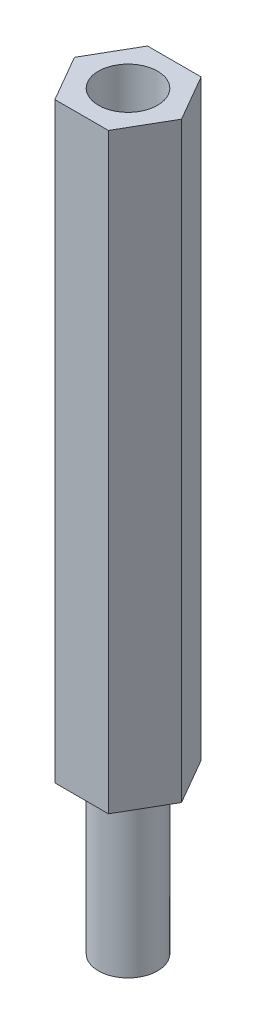
ISO-10303-21;
HEADER;
FILE_DESCRIPTION(('STEP AP214'),'2;1');
FILE_NAME('part.step','',(''),(''),'','','');
FILE_SCHEMA(('AUTOMOTIVE_DESIGN { 1 0 10303 214 1 1 1 1 }'));
ENDSEC;
DATA;
#1=APPLICATION_CONTEXT('core data for automotive mechanical design processes');
#2=APPLICATION_PROTOCOL_DEFINITION('international standard','automotive_design',2000,#1);
#3=PRODUCT_CONTEXT('',#1,'mechanical');
#4=PRODUCT('Part','Part','',(#3));
#5=PRODUCT_RELATED_PRODUCT_CATEGORY('part','',(#4));
#6=PRODUCT_DEFINITION_FORMATION('','',#4);
#7=PRODUCT_DEFINITION_CONTEXT('part definition',#1,'design');
#8=PRODUCT_DEFINITION('design','',#6,#7);
#9=PRODUCT_DEFINITION_SHAPE('','',#8);
#10=(LENGTH_UNIT() NAMED_UNIT(*) SI_UNIT(.MILLI.,.METRE.));
#11=(NAMED_UNIT(*) PLANE_ANGLE_UNIT() SI_UNIT($,.RADIAN.));
#12=(NAMED_UNIT(*) SI_UNIT($,.STERADIAN.) SOLID_ANGLE_UNIT());
#13=UNCERTAINTY_MEASURE_WITH_UNIT(LENGTH_MEASURE(1.E-05),#10,'distance_accuracy_value','');
#14=(GEOMETRIC_REPRESENTATION_CONTEXT(3) GLOBAL_UNCERTAINTY_ASSIGNED_CONTEXT((#13)) GLOBAL_UNIT_ASSIGNED_CONTEXT((#10,
#11,#12)) REPRESENTATION_CONTEXT('',''));
#15=CARTESIAN_POINT('',(0.,0.,0.));
#16=DIRECTION('',(0.,0.,1.));
#17=DIRECTION('',(1.,0.,0.));
#18=AXIS2_PLACEMENT_3D('',#15,#16,#17);
#19=CARTESIAN_POINT('',(0.,-8.,0.));
#20=DIRECTION('',(0.,1.,0.));
#21=DIRECTION('',(0.,0.,1.));
#22=AXIS2_PLACEMENT_3D('',#19,#20,#21);
#23=CYLINDRICAL_SURFACE('',#22,1.5);
#24=CARTESIAN_POINT('',(0.,-8.,0.));
#25=DIRECTION('',(0.,-1.,0.));
#26=DIRECTION('',(0.,0.,-1.));
#27=AXIS2_PLACEMENT_3D('',#24,#25,#26);
#28=CIRCLE('',#27,1.5);
#29=CARTESIAN_POINT('',(0.,-8.,-1.5));
#30=VERTEX_POINT('',#29);
#31=EDGE_CURVE('E11',#30,#30,#28,.T.);
#32=ORIENTED_EDGE('',*,*,#31,.F.);
#33=EDGE_LOOP('',(#32));
#34=FACE_BOUND('',#33,.T.);
#35=CARTESIAN_POINT('',(0.,0.,0.));
#36=DIRECTION('',(0.,-1.,0.));
#37=DIRECTION('',(0.,0.,-1.));
#38=AXIS2_PLACEMENT_3D('',#35,#36,#37);
#39=CIRCLE('',#38,1.5);
#40=CARTESIAN_POINT('',(0.,0.,-1.5));
#41=VERTEX_POINT('',#40);
#42=EDGE_CURVE('E45',#41,#41,#39,.T.);
#43=ORIENTED_EDGE('',*,*,#42,.T.);
#44=EDGE_LOOP('',(#43));
#45=FACE_BOUND('',#44,.T.);
#46=ADVANCED_FACE('F42',(#34,#45),#23,.T.);
#47=CARTESIAN_POINT('',(0.,-8.,0.));
#48=DIRECTION('',(0.,-1.,0.));
#49=DIRECTION('',(0.,0.,-1.));
#50=AXIS2_PLACEMENT_3D('',#47,#48,#49);
#51=PLANE('',#50);
#52=ORIENTED_EDGE('',*,*,#31,.T.);
#53=EDGE_LOOP('',(#52));
#54=FACE_BOUND('',#53,.T.);
#55=ADVANCED_FACE('F57',(#54),#51,.T.);
#56=CARTESIAN_POINT('',(0.,0.,0.));
#57=DIRECTION('',(0.,-1.,0.));
#58=DIRECTION('',(0.,0.,-1.));
#59=AXIS2_PLACEMENT_3D('',#56,#57,#58);
#60=PLANE('',#59);
#61=ORIENTED_EDGE('',*,*,#42,.F.);
#62=EDGE_LOOP('',(#61));
#63=FACE_BOUND('',#62,.T.);
#64=ADVANCED_FACE('F55',(#63),#60,.F.);
#65=CLOSED_SHELL('',(#46,#55,#64));
#66=MANIFOLD_SOLID_BREP('B2',#65);
#67=CARTESIAN_POINT('',(0.,30.,0.));
#68=DIRECTION('',(0.,1.,0.));
#69=DIRECTION('',(0.,0.,1.));
#70=AXIS2_PLACEMENT_3D('',#67,#68,#69);
#71=PLANE('',#70);
#72=DIRECTION('',(0.5,0.,-0.866025403784438));
#73=VECTOR('',#72,1.);
#74=CARTESIAN_POINT('',(1.35677313259562,30.,2.35));
#75=LINE('',#74,#73);
#76=CARTESIAN_POINT('',(1.35677313259562,30.,2.35));
#77=VERTEX_POINT('',#76);
#78=CARTESIAN_POINT('',(2.71354626519124,30.,0.));
#79=VERTEX_POINT('',#78);
#80=EDGE_CURVE('E178',#77,#79,#75,.T.);
#81=ORIENTED_EDGE('',*,*,#80,.T.);
#82=DIRECTION('',(-0.5,0.,-0.866025403784438));
#83=VECTOR('',#82,1.);
#84=CARTESIAN_POINT('',(2.71354626519124,30.,0.));
#85=LINE('',#84,#83);
#86=CARTESIAN_POINT('',(1.35677313259562,30.,-2.35));
#87=VERTEX_POINT('',#86);
#88=EDGE_CURVE('E136',#79,#87,#85,.T.);
#89=ORIENTED_EDGE('',*,*,#88,.T.);
#90=DIRECTION('',(-1.,0.,0.));
#91=VECTOR('',#90,1.);
#92=CARTESIAN_POINT('',(1.35677313259562,30.,-2.35));
#93=LINE('',#92,#91);
#94=CARTESIAN_POINT('',(-1.35677313259562,30.,-2.35));
#95=VERTEX_POINT('',#94);
#96=EDGE_CURVE('E149',#87,#95,#93,.T.);
#97=ORIENTED_EDGE('',*,*,#96,.T.);
#98=DIRECTION('',(-0.5,0.,0.866025403784439));
#99=VECTOR('',#98,1.);
#100=CARTESIAN_POINT('',(-1.35677313259562,30.,-2.35));
#101=LINE('',#100,#99);
#102=CARTESIAN_POINT('',(-2.71354626519124,30.,0.));
#103=VERTEX_POINT('',#102);
#104=EDGE_CURVE('E143',#95,#103,#101,.T.);
#105=ORIENTED_EDGE('',*,*,#104,.T.);
#106=DIRECTION('',(0.5,0.,0.866025403784438));
#107=VECTOR('',#106,1.);
#108=CARTESIAN_POINT('',(-2.71354626519124,30.,0.));
#109=LINE('',#108,#107);
#110=CARTESIAN_POINT('',(-1.35677313259562,30.,2.35));
#111=VERTEX_POINT('',#110);
#112=EDGE_CURVE('E147',#103,#111,#109,.T.);
#113=ORIENTED_EDGE('',*,*,#112,.T.);
#114=DIRECTION('',(1.,0.,0.));
#115=VECTOR('',#114,1.);
#116=CARTESIAN_POINT('',(-1.35677313259562,30.,2.35));
#117=LINE('',#116,#115);
#118=EDGE_CURVE('E99',#111,#77,#117,.T.);
#119=ORIENTED_EDGE('',*,*,#118,.T.);
#120=EDGE_LOOP('',(#81,#89,#97,#105,#113,#119));
#121=FACE_BOUND('',#120,.T.);
#122=CARTESIAN_POINT('',(0.,30.,0.));
#123=DIRECTION('',(0.,1.,0.));
#124=DIRECTION('',(0.,0.,1.));
#125=AXIS2_PLACEMENT_3D('',#122,#123,#124);
#126=CIRCLE('',#125,1.5);
#127=CARTESIAN_POINT('',(0.,30.,1.5));
#128=VERTEX_POINT('',#127);
#129=EDGE_CURVE('E171',#128,#128,#126,.T.);
#130=ORIENTED_EDGE('',*,*,#129,.F.);
#131=EDGE_LOOP('',(#130));
#132=FACE_BOUND('',#131,.T.);
#133=ADVANCED_FACE('F82',(#121,#132),#71,.T.);
#134=CARTESIAN_POINT('',(0.,0.,0.));
#135=DIRECTION('',(0.,1.,0.));
#136=DIRECTION('',(0.,0.,1.));
#137=AXIS2_PLACEMENT_3D('',#134,#135,#136);
#138=PLANE('',#137);
#139=DIRECTION('',(0.5,0.,-0.866025403784438));
#140=VECTOR('',#139,1.);
#141=CARTESIAN_POINT('',(1.35677313259562,0.,2.35));
#142=LINE('',#141,#140);
#143=CARTESIAN_POINT('',(1.35677313259562,0.,2.35));
#144=VERTEX_POINT('',#143);
#145=CARTESIAN_POINT('',(2.71354626519124,0.,0.));
#146=VERTEX_POINT('',#145);
#147=EDGE_CURVE('E167',#144,#146,#142,.T.);
#148=ORIENTED_EDGE('',*,*,#147,.F.);
#149=DIRECTION('',(1.,0.,0.));
#150=VECTOR('',#149,1.);
#151=CARTESIAN_POINT('',(-1.35677313259562,0.,2.35));
#152=LINE('',#151,#150);
#153=CARTESIAN_POINT('',(-1.35677313259562,0.,2.35));
#154=VERTEX_POINT('',#153);
#155=EDGE_CURVE('E128',#154,#144,#152,.T.);
#156=ORIENTED_EDGE('',*,*,#155,.F.);
#157=DIRECTION('',(0.5,0.,0.866025403784438));
#158=VECTOR('',#157,1.);
#159=CARTESIAN_POINT('',(-2.71354626519124,0.,0.));
#160=LINE('',#159,#158);
#161=CARTESIAN_POINT('',(-2.71354626519124,0.,0.));
#162=VERTEX_POINT('',#161);
#163=EDGE_CURVE('E122',#162,#154,#160,.T.);
#164=ORIENTED_EDGE('',*,*,#163,.F.);
#165=DIRECTION('',(-0.5,0.,0.866025403784439));
#166=VECTOR('',#165,1.);
#167=CARTESIAN_POINT('',(-1.35677313259562,0.,-2.35));
#168=LINE('',#167,#166);
#169=CARTESIAN_POINT('',(-1.35677313259562,0.,-2.35));
#170=VERTEX_POINT('',#169);
#171=EDGE_CURVE('E157',#170,#162,#168,.T.);
#172=ORIENTED_EDGE('',*,*,#171,.F.);
#173=DIRECTION('',(-1.,0.,0.));
#174=VECTOR('',#173,1.);
#175=CARTESIAN_POINT('',(1.35677313259562,0.,-2.35));
#176=LINE('',#175,#174);
#177=CARTESIAN_POINT('',(1.35677313259562,0.,-2.35));
#178=VERTEX_POINT('',#177);
#179=EDGE_CURVE('E173',#178,#170,#176,.T.);
#180=ORIENTED_EDGE('',*,*,#179,.F.);
#181=DIRECTION('',(-0.5,0.,-0.866025403784438));
#182=VECTOR('',#181,1.);
#183=CARTESIAN_POINT('',(2.71354626519124,0.,0.));
#184=LINE('',#183,#182);
#185=EDGE_CURVE('E170',#146,#178,#184,.T.);
#186=ORIENTED_EDGE('',*,*,#185,.F.);
#187=EDGE_LOOP('',(#148,#156,#164,#172,#180,#186));
#188=FACE_BOUND('',#187,.T.);
#189=CARTESIAN_POINT('',(0.,0.,0.));
#190=DIRECTION('',(0.,1.,0.));
#191=DIRECTION('',(0.,0.,1.));
#192=AXIS2_PLACEMENT_3D('',#189,#190,#191);
#193=CIRCLE('',#192,1.5);
#194=CARTESIAN_POINT('',(0.,0.,1.5));
#195=VERTEX_POINT('',#194);
#196=EDGE_CURVE('E271',#195,#195,#193,.T.);
#197=ORIENTED_EDGE('',*,*,#196,.T.);
#198=EDGE_LOOP('',(#197));
#199=FACE_BOUND('',#198,.T.);
#200=ADVANCED_FACE('F187',(#188,#199),#138,.F.);
#201=CARTESIAN_POINT('',(1.35677313259562,30.,2.35));
#202=DIRECTION('',(-0.866025403784439,0.,-0.5));
#203=DIRECTION('',(-0.5,0.,0.866025403784439));
#204=AXIS2_PLACEMENT_3D('',#201,#202,#203);
#205=PLANE('',#204);
#206=ORIENTED_EDGE('',*,*,#147,.T.);
#207=DIRECTION('',(0.,-1.,0.));
#208=VECTOR('',#207,1.);
#209=CARTESIAN_POINT('',(2.71354626519124,30.,0.));
#210=LINE('',#209,#208);
#211=EDGE_CURVE('E40',#79,#146,#210,.T.);
#212=ORIENTED_EDGE('',*,*,#211,.F.);
#213=ORIENTED_EDGE('',*,*,#80,.F.);
#214=DIRECTION('',(0.,-1.,0.));
#215=VECTOR('',#214,1.);
#216=CARTESIAN_POINT('',(1.35677313259562,30.,2.35));
#217=LINE('',#216,#215);
#218=EDGE_CURVE('E163',#77,#144,#217,.T.);
#219=ORIENTED_EDGE('',*,*,#218,.T.);
#220=EDGE_LOOP('',(#206,#212,#213,#219));
#221=FACE_BOUND('',#220,.T.);
#222=ADVANCED_FACE('F84',(#221),#205,.F.);
#223=CARTESIAN_POINT('',(2.71354626519124,30.,0.));
#224=DIRECTION('',(-0.866025403784438,0.,0.5));
#225=DIRECTION('',(0.5,0.,0.866025403784438));
#226=AXIS2_PLACEMENT_3D('',#223,#224,#225);
#227=PLANE('',#226);
#228=ORIENTED_EDGE('',*,*,#185,.T.);
#229=DIRECTION('',(0.,-1.,0.));
#230=VECTOR('',#229,1.);
#231=CARTESIAN_POINT('',(1.35677313259562,30.,-2.35));
#232=LINE('',#231,#230);
#233=EDGE_CURVE('E91',#87,#178,#232,.T.);
#234=ORIENTED_EDGE('',*,*,#233,.F.);
#235=ORIENTED_EDGE('',*,*,#88,.F.);
#236=ORIENTED_EDGE('',*,*,#211,.T.);
#237=EDGE_LOOP('',(#228,#234,#235,#236));
#238=FACE_BOUND('',#237,.T.);
#239=ADVANCED_FACE('F212',(#238),#227,.F.);
#240=CARTESIAN_POINT('',(1.35677313259562,30.,-2.35));
#241=DIRECTION('',(0.,0.,1.));
#242=DIRECTION('',(1.,0.,0.));
#243=AXIS2_PLACEMENT_3D('',#240,#241,#242);
#244=PLANE('',#243);
#245=ORIENTED_EDGE('',*,*,#179,.T.);
#246=DIRECTION('',(0.,-1.,0.));
#247=VECTOR('',#246,1.);
#248=CARTESIAN_POINT('',(-1.35677313259562,30.,-2.35));
#249=LINE('',#248,#247);
#250=EDGE_CURVE('E158',#95,#170,#249,.T.);
#251=ORIENTED_EDGE('',*,*,#250,.F.);
#252=ORIENTED_EDGE('',*,*,#96,.F.);
#253=ORIENTED_EDGE('',*,*,#233,.T.);
#254=EDGE_LOOP('',(#245,#251,#252,#253));
#255=FACE_BOUND('',#254,.T.);
#256=ADVANCED_FACE('F184',(#255),#244,.F.);
#257=CARTESIAN_POINT('',(-1.35677313259562,30.,-2.35));
#258=DIRECTION('',(0.866025403784439,0.,0.5));
#259=DIRECTION('',(0.5,0.,-0.866025403784439));
#260=AXIS2_PLACEMENT_3D('',#257,#258,#259);
#261=PLANE('',#260);
#262=ORIENTED_EDGE('',*,*,#171,.T.);
#263=DIRECTION('',(0.,-1.,0.));
#264=VECTOR('',#263,1.);
#265=CARTESIAN_POINT('',(-2.71354626519124,30.,0.));
#266=LINE('',#265,#264);
#267=EDGE_CURVE('E154',#103,#162,#266,.T.);
#268=ORIENTED_EDGE('',*,*,#267,.F.);
#269=ORIENTED_EDGE('',*,*,#104,.F.);
#270=ORIENTED_EDGE('',*,*,#250,.T.);
#271=EDGE_LOOP('',(#262,#268,#269,#270));
#272=FACE_BOUND('',#271,.T.);
#273=ADVANCED_FACE('F155',(#272),#261,.F.);
#274=CARTESIAN_POINT('',(-2.71354626519124,30.,0.));
#275=DIRECTION('',(0.866025403784438,0.,-0.5));
#276=DIRECTION('',(-0.5,0.,-0.866025403784439));
#277=AXIS2_PLACEMENT_3D('',#274,#275,#276);
#278=PLANE('',#277);
#279=ORIENTED_EDGE('',*,*,#163,.T.);
#280=DIRECTION('',(0.,-1.,0.));
#281=VECTOR('',#280,1.);
#282=CARTESIAN_POINT('',(-1.35677313259562,30.,2.35));
#283=LINE('',#282,#281);
#284=EDGE_CURVE('E159',#111,#154,#283,.T.);
#285=ORIENTED_EDGE('',*,*,#284,.F.);
#286=ORIENTED_EDGE('',*,*,#112,.F.);
#287=ORIENTED_EDGE('',*,*,#267,.T.);
#288=EDGE_LOOP('',(#279,#285,#286,#287));
#289=FACE_BOUND('',#288,.T.);
#290=ADVANCED_FACE('F161',(#289),#278,.F.);
#291=CARTESIAN_POINT('',(-1.35677313259562,30.,2.35));
#292=DIRECTION('',(0.,0.,-1.));
#293=DIRECTION('',(-1.,0.,0.));
#294=AXIS2_PLACEMENT_3D('',#291,#292,#293);
#295=PLANE('',#294);
#296=ORIENTED_EDGE('',*,*,#155,.T.);
#297=ORIENTED_EDGE('',*,*,#218,.F.);
#298=ORIENTED_EDGE('',*,*,#118,.F.);
#299=ORIENTED_EDGE('',*,*,#284,.T.);
#300=EDGE_LOOP('',(#296,#297,#298,#299));
#301=FACE_BOUND('',#300,.T.);
#302=ADVANCED_FACE('F192',(#301),#295,.F.);
#303=CARTESIAN_POINT('',(0.,30.,0.));
#304=DIRECTION('',(0.,-1.,0.));
#305=DIRECTION('',(0.,0.,-1.));
#306=AXIS2_PLACEMENT_3D('',#303,#304,#305);
#307=CYLINDRICAL_SURFACE('',#306,1.5);
#308=ORIENTED_EDGE('',*,*,#129,.T.);
#309=EDGE_LOOP('',(#308));
#310=FACE_BOUND('',#309,.T.);
#311=ORIENTED_EDGE('',*,*,#196,.F.);
#312=EDGE_LOOP('',(#311));
#313=FACE_BOUND('',#312,.T.);
#314=ADVANCED_FACE('F194',(#310,#313),#307,.F.);
#315=CLOSED_SHELL('',(#133,#200,#222,#239,#256,#273,#290,#302,#314));
#316=MANIFOLD_SOLID_BREP('B6',#315);
#317=ADVANCED_BREP_SHAPE_REPRESENTATION('',(#18,#66,#316),#14);
#318=SHAPE_DEFINITION_REPRESENTATION(#9,#317);
ENDSEC;
END-ISO-10303-21;
